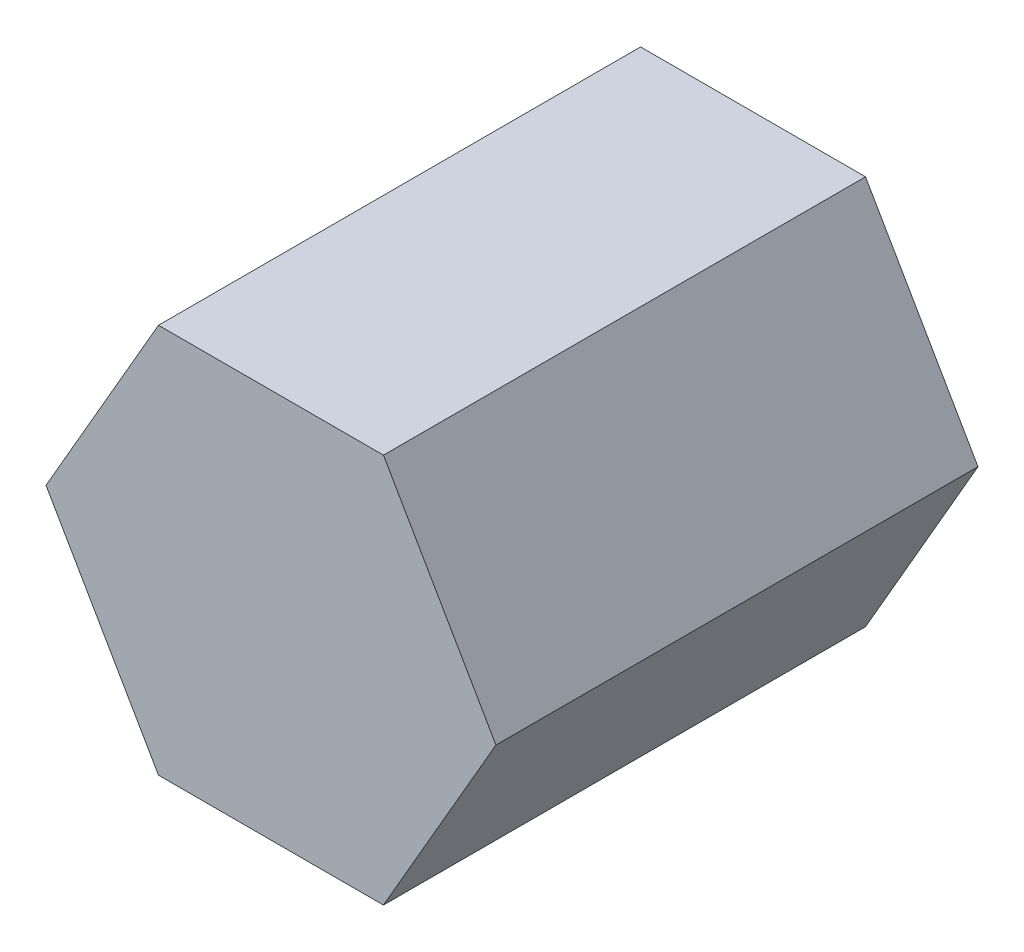
ISO-10303-21;
HEADER;
FILE_DESCRIPTION(('STEP AP214'),'2;1');
FILE_NAME('part.step','',(''),(''),'','','');
FILE_SCHEMA(('AUTOMOTIVE_DESIGN { 1 0 10303 214 1 1 1 1 }'));
ENDSEC;
DATA;
#1=APPLICATION_CONTEXT('core data for automotive mechanical design processes');
#2=APPLICATION_PROTOCOL_DEFINITION('international standard','automotive_design',2000,#1);
#3=PRODUCT_CONTEXT('',#1,'mechanical');
#4=PRODUCT('Part','Part','',(#3));
#5=PRODUCT_RELATED_PRODUCT_CATEGORY('part','',(#4));
#6=PRODUCT_DEFINITION_FORMATION('','',#4);
#7=PRODUCT_DEFINITION_CONTEXT('part definition',#1,'design');
#8=PRODUCT_DEFINITION('design','',#6,#7);
#9=PRODUCT_DEFINITION_SHAPE('','',#8);
#10=(LENGTH_UNIT() NAMED_UNIT(*) SI_UNIT(.MILLI.,.METRE.));
#11=(NAMED_UNIT(*) PLANE_ANGLE_UNIT() SI_UNIT($,.RADIAN.));
#12=(NAMED_UNIT(*) SI_UNIT($,.STERADIAN.) SOLID_ANGLE_UNIT());
#13=UNCERTAINTY_MEASURE_WITH_UNIT(LENGTH_MEASURE(1.E-05),#10,'distance_accuracy_value','');
#14=(GEOMETRIC_REPRESENTATION_CONTEXT(3) GLOBAL_UNCERTAINTY_ASSIGNED_CONTEXT((#13)) GLOBAL_UNIT_ASSIGNED_CONTEXT((#10,
#11,#12)) REPRESENTATION_CONTEXT('',''));
#15=CARTESIAN_POINT('',(0.,0.,0.));
#16=DIRECTION('',(0.,0.,1.));
#17=DIRECTION('',(1.,0.,0.));
#18=AXIS2_PLACEMENT_3D('',#15,#16,#17);
#19=CARTESIAN_POINT('',(14.,-24.2487113059643,60.));
#20=DIRECTION('',(-0.866025403784439,0.5,0.));
#21=DIRECTION('',(-0.5,-0.866025403784439,0.));
#22=AXIS2_PLACEMENT_3D('',#19,#20,#21);
#23=PLANE('',#22);
#24=DIRECTION('',(0.5,0.866025403784439,0.));
#25=VECTOR('',#24,1.);
#26=CARTESIAN_POINT('',(14.,-24.2487113059643,0.));
#27=LINE('',#26,#25);
#28=CARTESIAN_POINT('',(14.,-24.2487113059643,0.));
#29=VERTEX_POINT('',#28);
#30=CARTESIAN_POINT('',(28.,0.,0.));
#31=VERTEX_POINT('',#30);
#32=EDGE_CURVE('E121',#29,#31,#27,.T.);
#33=ORIENTED_EDGE('',*,*,#32,.T.);
#34=DIRECTION('',(0.,0.,-1.));
#35=VECTOR('',#34,1.);
#36=CARTESIAN_POINT('',(28.,0.,60.));
#37=LINE('',#36,#35);
#38=CARTESIAN_POINT('',(28.,0.,60.));
#39=VERTEX_POINT('',#38);
#40=EDGE_CURVE('E11',#39,#31,#37,.T.);
#41=ORIENTED_EDGE('',*,*,#40,.F.);
#42=DIRECTION('',(0.5,0.866025403784439,0.));
#43=VECTOR('',#42,1.);
#44=CARTESIAN_POINT('',(14.,-24.2487113059643,60.));
#45=LINE('',#44,#43);
#46=CARTESIAN_POINT('',(14.,-24.2487113059643,60.));
#47=VERTEX_POINT('',#46);
#48=EDGE_CURVE('E133',#47,#39,#45,.T.);
#49=ORIENTED_EDGE('',*,*,#48,.F.);
#50=DIRECTION('',(0.,0.,-1.));
#51=VECTOR('',#50,1.);
#52=CARTESIAN_POINT('',(14.,-24.2487113059643,60.));
#53=LINE('',#52,#51);
#54=EDGE_CURVE('E116',#47,#29,#53,.T.);
#55=ORIENTED_EDGE('',*,*,#54,.T.);
#56=EDGE_LOOP('',(#33,#41,#49,#55));
#57=FACE_BOUND('',#56,.T.);
#58=ADVANCED_FACE('F39',(#57),#23,.F.);
#59=CARTESIAN_POINT('',(28.,0.,60.));
#60=DIRECTION('',(-0.866025403784439,-0.5,0.));
#61=DIRECTION('',(0.5,-0.866025403784439,0.));
#62=AXIS2_PLACEMENT_3D('',#59,#60,#61);
#63=PLANE('',#62);
#64=DIRECTION('',(-0.5,0.866025403784439,0.));
#65=VECTOR('',#64,1.);
#66=CARTESIAN_POINT('',(28.,0.,0.));
#67=LINE('',#66,#65);
#68=CARTESIAN_POINT('',(14.,24.2487113059643,0.));
#69=VERTEX_POINT('',#68);
#70=EDGE_CURVE('E128',#31,#69,#67,.T.);
#71=ORIENTED_EDGE('',*,*,#70,.T.);
#72=DIRECTION('',(0.,0.,-1.));
#73=VECTOR('',#72,1.);
#74=CARTESIAN_POINT('',(14.,24.2487113059643,60.));
#75=LINE('',#74,#73);
#76=CARTESIAN_POINT('',(14.,24.2487113059643,60.));
#77=VERTEX_POINT('',#76);
#78=EDGE_CURVE('E50',#77,#69,#75,.T.);
#79=ORIENTED_EDGE('',*,*,#78,.F.);
#80=DIRECTION('',(-0.5,0.866025403784439,0.));
#81=VECTOR('',#80,1.);
#82=CARTESIAN_POINT('',(28.,0.,60.));
#83=LINE('',#82,#81);
#84=EDGE_CURVE('E95',#39,#77,#83,.T.);
#85=ORIENTED_EDGE('',*,*,#84,.F.);
#86=ORIENTED_EDGE('',*,*,#40,.T.);
#87=EDGE_LOOP('',(#71,#79,#85,#86));
#88=FACE_BOUND('',#87,.T.);
#89=ADVANCED_FACE('F160',(#88),#63,.F.);
#90=CARTESIAN_POINT('',(14.,24.2487113059643,60.));
#91=DIRECTION('',(0.,-1.,0.));
#92=DIRECTION('',(1.,0.,0.));
#93=AXIS2_PLACEMENT_3D('',#90,#91,#92);
#94=PLANE('',#93);
#95=DIRECTION('',(-1.,0.,0.));
#96=VECTOR('',#95,1.);
#97=CARTESIAN_POINT('',(14.,24.2487113059643,0.));
#98=LINE('',#97,#96);
#99=CARTESIAN_POINT('',(-14.,24.2487113059643,0.));
#100=VERTEX_POINT('',#99);
#101=EDGE_CURVE('E126',#69,#100,#98,.T.);
#102=ORIENTED_EDGE('',*,*,#101,.T.);
#103=DIRECTION('',(0.,0.,-1.));
#104=VECTOR('',#103,1.);
#105=CARTESIAN_POINT('',(-14.,24.2487113059643,60.));
#106=LINE('',#105,#104);
#107=CARTESIAN_POINT('',(-14.,24.2487113059643,60.));
#108=VERTEX_POINT('',#107);
#109=EDGE_CURVE('E114',#108,#100,#106,.T.);
#110=ORIENTED_EDGE('',*,*,#109,.F.);
#111=DIRECTION('',(-1.,0.,0.));
#112=VECTOR('',#111,1.);
#113=CARTESIAN_POINT('',(14.,24.2487113059643,60.));
#114=LINE('',#113,#112);
#115=EDGE_CURVE('E103',#77,#108,#114,.T.);
#116=ORIENTED_EDGE('',*,*,#115,.F.);
#117=ORIENTED_EDGE('',*,*,#78,.T.);
#118=EDGE_LOOP('',(#102,#110,#116,#117));
#119=FACE_BOUND('',#118,.T.);
#120=ADVANCED_FACE('F137',(#119),#94,.F.);
#121=CARTESIAN_POINT('',(-14.,24.2487113059643,60.));
#122=DIRECTION('',(0.866025403784438,-0.5,0.));
#123=DIRECTION('',(0.5,0.866025403784439,0.));
#124=AXIS2_PLACEMENT_3D('',#121,#122,#123);
#125=PLANE('',#124);
#126=DIRECTION('',(-0.5,-0.866025403784438,0.));
#127=VECTOR('',#126,1.);
#128=CARTESIAN_POINT('',(-14.,24.2487113059643,0.));
#129=LINE('',#128,#127);
#130=CARTESIAN_POINT('',(-28.,0.,0.));
#131=VERTEX_POINT('',#130);
#132=EDGE_CURVE('E111',#100,#131,#129,.T.);
#133=ORIENTED_EDGE('',*,*,#132,.T.);
#134=DIRECTION('',(0.,0.,-1.));
#135=VECTOR('',#134,1.);
#136=CARTESIAN_POINT('',(-28.,0.,60.));
#137=LINE('',#136,#135);
#138=CARTESIAN_POINT('',(-28.,0.,60.));
#139=VERTEX_POINT('',#138);
#140=EDGE_CURVE('E108',#139,#131,#137,.T.);
#141=ORIENTED_EDGE('',*,*,#140,.F.);
#142=DIRECTION('',(-0.5,-0.866025403784438,0.));
#143=VECTOR('',#142,1.);
#144=CARTESIAN_POINT('',(-14.,24.2487113059643,60.));
#145=LINE('',#144,#143);
#146=EDGE_CURVE('E98',#108,#139,#145,.T.);
#147=ORIENTED_EDGE('',*,*,#146,.F.);
#148=ORIENTED_EDGE('',*,*,#109,.T.);
#149=EDGE_LOOP('',(#133,#141,#147,#148));
#150=FACE_BOUND('',#149,.T.);
#151=ADVANCED_FACE('F112',(#150),#125,.F.);
#152=CARTESIAN_POINT('',(-28.,0.,60.));
#153=DIRECTION('',(0.866025403784439,0.5,0.));
#154=DIRECTION('',(-0.5,0.866025403784439,0.));
#155=AXIS2_PLACEMENT_3D('',#152,#153,#154);
#156=PLANE('',#155);
#157=DIRECTION('',(0.5,-0.866025403784439,0.));
#158=VECTOR('',#157,1.);
#159=CARTESIAN_POINT('',(-28.,0.,0.));
#160=LINE('',#159,#158);
#161=CARTESIAN_POINT('',(-14.,-24.2487113059643,0.));
#162=VERTEX_POINT('',#161);
#163=EDGE_CURVE('E76',#131,#162,#160,.T.);
#164=ORIENTED_EDGE('',*,*,#163,.T.);
#165=DIRECTION('',(0.,0.,-1.));
#166=VECTOR('',#165,1.);
#167=CARTESIAN_POINT('',(-14.,-24.2487113059643,60.));
#168=LINE('',#167,#166);
#169=CARTESIAN_POINT('',(-14.,-24.2487113059643,60.));
#170=VERTEX_POINT('',#169);
#171=EDGE_CURVE('E113',#170,#162,#168,.T.);
#172=ORIENTED_EDGE('',*,*,#171,.F.);
#173=DIRECTION('',(0.5,-0.866025403784439,0.));
#174=VECTOR('',#173,1.);
#175=CARTESIAN_POINT('',(-28.,0.,60.));
#176=LINE('',#175,#174);
#177=EDGE_CURVE('E104',#139,#170,#176,.T.);
#178=ORIENTED_EDGE('',*,*,#177,.F.);
#179=ORIENTED_EDGE('',*,*,#140,.T.);
#180=EDGE_LOOP('',(#164,#172,#178,#179));
#181=FACE_BOUND('',#180,.T.);
#182=ADVANCED_FACE('F119',(#181),#156,.F.);
#183=CARTESIAN_POINT('',(-14.,-24.2487113059643,60.));
#184=DIRECTION('',(0.,1.,0.));
#185=DIRECTION('',(-1.,0.,0.));
#186=AXIS2_PLACEMENT_3D('',#183,#184,#185);
#187=PLANE('',#186);
#188=DIRECTION('',(1.,0.,0.));
#189=VECTOR('',#188,1.);
#190=CARTESIAN_POINT('',(-14.,-24.2487113059643,0.));
#191=LINE('',#190,#189);
#192=EDGE_CURVE('E84',#162,#29,#191,.T.);
#193=ORIENTED_EDGE('',*,*,#192,.T.);
#194=ORIENTED_EDGE('',*,*,#54,.F.);
#195=DIRECTION('',(1.,0.,0.));
#196=VECTOR('',#195,1.);
#197=CARTESIAN_POINT('',(-14.,-24.2487113059643,60.));
#198=LINE('',#197,#196);
#199=EDGE_CURVE('E54',#170,#47,#198,.T.);
#200=ORIENTED_EDGE('',*,*,#199,.F.);
#201=ORIENTED_EDGE('',*,*,#171,.T.);
#202=EDGE_LOOP('',(#193,#194,#200,#201));
#203=FACE_BOUND('',#202,.T.);
#204=ADVANCED_FACE('F147',(#203),#187,.F.);
#205=CARTESIAN_POINT('',(0.,0.,60.));
#206=DIRECTION('',(0.,0.,1.));
#207=DIRECTION('',(1.,0.,0.));
#208=AXIS2_PLACEMENT_3D('',#205,#206,#207);
#209=PLANE('',#208);
#210=ORIENTED_EDGE('',*,*,#48,.T.);
#211=ORIENTED_EDGE('',*,*,#84,.T.);
#212=ORIENTED_EDGE('',*,*,#115,.T.);
#213=ORIENTED_EDGE('',*,*,#146,.T.);
#214=ORIENTED_EDGE('',*,*,#177,.T.);
#215=ORIENTED_EDGE('',*,*,#199,.T.);
#216=EDGE_LOOP('',(#210,#211,#212,#213,#214,#215));
#217=FACE_BOUND('',#216,.T.);
#218=ADVANCED_FACE('F102',(#217),#209,.T.);
#219=CARTESIAN_POINT('',(0.,0.,0.));
#220=DIRECTION('',(0.,0.,1.));
#221=DIRECTION('',(1.,0.,0.));
#222=AXIS2_PLACEMENT_3D('',#219,#220,#221);
#223=PLANE('',#222);
#224=ORIENTED_EDGE('',*,*,#32,.F.);
#225=ORIENTED_EDGE('',*,*,#192,.F.);
#226=ORIENTED_EDGE('',*,*,#163,.F.);
#227=ORIENTED_EDGE('',*,*,#132,.F.);
#228=ORIENTED_EDGE('',*,*,#101,.F.);
#229=ORIENTED_EDGE('',*,*,#70,.F.);
#230=EDGE_LOOP('',(#224,#225,#226,#227,#228,#229));
#231=FACE_BOUND('',#230,.T.);
#232=ADVANCED_FACE('F145',(#231),#223,.F.);
#233=CLOSED_SHELL('',(#58,#89,#120,#151,#182,#204,#218,#232));
#234=MANIFOLD_SOLID_BREP('B2',#233);
#235=ADVANCED_BREP_SHAPE_REPRESENTATION('',(#18,#234),#14);
#236=SHAPE_DEFINITION_REPRESENTATION(#9,#235);
ENDSEC;
END-ISO-10303-21;
